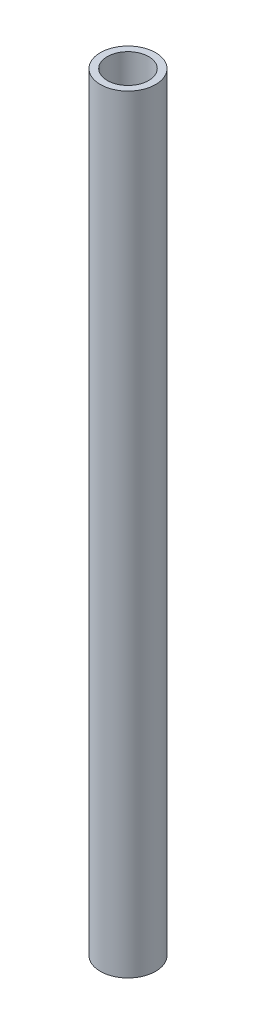
ISO-10303-21;
HEADER;
FILE_DESCRIPTION(('STEP AP214'),'2;1');
FILE_NAME('part.step','',(''),(''),'','','');
FILE_SCHEMA(('AUTOMOTIVE_DESIGN { 1 0 10303 214 1 1 1 1 }'));
ENDSEC;
DATA;
#1=APPLICATION_CONTEXT('core data for automotive mechanical design processes');
#2=APPLICATION_PROTOCOL_DEFINITION('international standard','automotive_design',2000,#1);
#3=PRODUCT_CONTEXT('',#1,'mechanical');
#4=PRODUCT('Part','Part','',(#3));
#5=PRODUCT_RELATED_PRODUCT_CATEGORY('part','',(#4));
#6=PRODUCT_DEFINITION_FORMATION('','',#4);
#7=PRODUCT_DEFINITION_CONTEXT('part definition',#1,'design');
#8=PRODUCT_DEFINITION('design','',#6,#7);
#9=PRODUCT_DEFINITION_SHAPE('','',#8);
#10=(LENGTH_UNIT() NAMED_UNIT(*) SI_UNIT(.MILLI.,.METRE.));
#11=(NAMED_UNIT(*) PLANE_ANGLE_UNIT() SI_UNIT($,.RADIAN.));
#12=(NAMED_UNIT(*) SI_UNIT($,.STERADIAN.) SOLID_ANGLE_UNIT());
#13=UNCERTAINTY_MEASURE_WITH_UNIT(LENGTH_MEASURE(1.E-05),#10,'distance_accuracy_value','');
#14=(GEOMETRIC_REPRESENTATION_CONTEXT(3) GLOBAL_UNCERTAINTY_ASSIGNED_CONTEXT((#13)) GLOBAL_UNIT_ASSIGNED_CONTEXT((#10,
#11,#12)) REPRESENTATION_CONTEXT('',''));
#15=CARTESIAN_POINT('',(0.,0.,0.));
#16=DIRECTION('',(0.,0.,1.));
#17=DIRECTION('',(1.,0.,0.));
#18=AXIS2_PLACEMENT_3D('',#15,#16,#17);
#19=CARTESIAN_POINT('',(0.,13.9,0.));
#20=DIRECTION('',(0.,-1.,0.));
#21=DIRECTION('',(0.,0.,-1.));
#22=AXIS2_PLACEMENT_3D('',#19,#20,#21);
#23=CYLINDRICAL_SURFACE('',#22,0.5);
#24=CARTESIAN_POINT('',(0.,13.9,0.));
#25=DIRECTION('',(0.,1.,0.));
#26=DIRECTION('',(0.,0.,1.));
#27=AXIS2_PLACEMENT_3D('',#24,#25,#26);
#28=CIRCLE('',#27,0.5);
#29=CARTESIAN_POINT('',(0.,13.9,0.5));
#30=VERTEX_POINT('',#29);
#31=EDGE_CURVE('E10',#30,#30,#28,.T.);
#32=ORIENTED_EDGE('',*,*,#31,.F.);
#33=EDGE_LOOP('',(#32));
#34=FACE_BOUND('',#33,.T.);
#35=CARTESIAN_POINT('',(0.,0.,0.));
#36=DIRECTION('',(0.,1.,0.));
#37=DIRECTION('',(0.,0.,1.));
#38=AXIS2_PLACEMENT_3D('',#35,#36,#37);
#39=CIRCLE('',#38,0.5);
#40=CARTESIAN_POINT('',(0.,0.,0.5));
#41=VERTEX_POINT('',#40);
#42=EDGE_CURVE('E40',#41,#41,#39,.T.);
#43=ORIENTED_EDGE('',*,*,#42,.T.);
#44=EDGE_LOOP('',(#43));
#45=FACE_BOUND('',#44,.T.);
#46=ADVANCED_FACE('F33',(#34,#45),#23,.T.);
#47=CARTESIAN_POINT('',(0.,13.9,0.));
#48=DIRECTION('',(0.,1.,0.));
#49=DIRECTION('',(0.,0.,1.));
#50=AXIS2_PLACEMENT_3D('',#47,#48,#49);
#51=PLANE('',#50);
#52=CARTESIAN_POINT('',(0.,13.9,0.));
#53=DIRECTION('',(0.,1.,0.));
#54=DIRECTION('',(0.,0.,1.));
#55=AXIS2_PLACEMENT_3D('',#52,#53,#54);
#56=CIRCLE('',#55,0.375);
#57=CARTESIAN_POINT('',(0.,13.9,0.375));
#58=VERTEX_POINT('',#57);
#59=EDGE_CURVE('E49',#58,#58,#56,.T.);
#60=ORIENTED_EDGE('',*,*,#59,.F.);
#61=EDGE_LOOP('',(#60));
#62=FACE_BOUND('',#61,.T.);
#63=ORIENTED_EDGE('',*,*,#31,.T.);
#64=EDGE_LOOP('',(#63));
#65=FACE_BOUND('',#64,.T.);
#66=ADVANCED_FACE('F65',(#62,#65),#51,.T.);
#67=CARTESIAN_POINT('',(0.,0.,0.));
#68=DIRECTION('',(0.,1.,0.));
#69=DIRECTION('',(0.,0.,1.));
#70=AXIS2_PLACEMENT_3D('',#67,#68,#69);
#71=PLANE('',#70);
#72=CARTESIAN_POINT('',(0.,0.,0.));
#73=DIRECTION('',(0.,-1.,0.));
#74=DIRECTION('',(0.,0.,-1.));
#75=AXIS2_PLACEMENT_3D('',#72,#73,#74);
#76=CIRCLE('',#75,0.299999999999989);
#77=CARTESIAN_POINT('',(0.,0.,-0.299999999999989));
#78=VERTEX_POINT('',#77);
#79=EDGE_CURVE('E55',#78,#78,#76,.T.);
#80=ORIENTED_EDGE('',*,*,#79,.F.);
#81=EDGE_LOOP('',(#80));
#82=FACE_BOUND('',#81,.T.);
#83=ORIENTED_EDGE('',*,*,#42,.F.);
#84=EDGE_LOOP('',(#83));
#85=FACE_BOUND('',#84,.T.);
#86=ADVANCED_FACE('F61',(#82,#85),#71,.F.);
#87=CARTESIAN_POINT('',(0.,2.575,0.));
#88=DIRECTION('',(0.,1.,0.));
#89=DIRECTION('',(0.,0.,1.));
#90=AXIS2_PLACEMENT_3D('',#87,#88,#89);
#91=CONICAL_SURFACE('',#90,0.374999999999997,1.02974425867665);
#92=CARTESIAN_POINT('',(0.,2.47746772678647,0.));
#93=DIRECTION('',(0.,-1.,0.));
#94=DIRECTION('',(0.,0.,-1.));
#95=AXIS2_PLACEMENT_3D('',#92,#93,#94);
#96=CIRCLE('',#95,0.21267903882371);
#97=CARTESIAN_POINT('',(0.,2.47746772678647,-0.21267903882371));
#98=VERTEX_POINT('',#97);
#99=EDGE_CURVE('E36',#98,#98,#96,.T.);
#100=ORIENTED_EDGE('',*,*,#99,.T.);
#101=EDGE_LOOP('',(#100));
#102=FACE_BOUND('',#101,.T.);
#103=CARTESIAN_POINT('',(0.,2.575,0.));
#104=DIRECTION('',(0.,1.,0.));
#105=DIRECTION('',(0.,0.,1.));
#106=AXIS2_PLACEMENT_3D('',#103,#104,#105);
#107=CIRCLE('',#106,0.374999999999997);
#108=CARTESIAN_POINT('',(0.,2.575,0.374999999999997));
#109=VERTEX_POINT('',#108);
#110=EDGE_CURVE('E45',#109,#109,#107,.T.);
#111=ORIENTED_EDGE('',*,*,#110,.T.);
#112=EDGE_LOOP('',(#111));
#113=FACE_BOUND('',#112,.T.);
#114=ADVANCED_FACE('F64',(#102,#113),#91,.F.);
#115=CARTESIAN_POINT('',(0.,13.9,0.));
#116=DIRECTION('',(0.,1.,0.));
#117=DIRECTION('',(0.,0.,1.));
#118=AXIS2_PLACEMENT_3D('',#115,#116,#117);
#119=CYLINDRICAL_SURFACE('',#118,0.374999999999999);
#120=ORIENTED_EDGE('',*,*,#110,.F.);
#121=EDGE_LOOP('',(#120));
#122=FACE_BOUND('',#121,.T.);
#123=ORIENTED_EDGE('',*,*,#59,.T.);
#124=EDGE_LOOP('',(#123));
#125=FACE_BOUND('',#124,.T.);
#126=ADVANCED_FACE('F81',(#122,#125),#119,.F.);
#127=CARTESIAN_POINT('',(0.,2.425,0.));
#128=DIRECTION('',(0.,-1.,0.));
#129=DIRECTION('',(0.,0.,-1.));
#130=AXIS2_PLACEMENT_3D('',#127,#128,#129);
#131=CONICAL_SURFACE('',#130,0.299999999999999,1.02974425867665);
#132=CARTESIAN_POINT('',(0.,2.425,0.));
#133=DIRECTION('',(0.,-1.,0.));
#134=DIRECTION('',(0.,0.,-1.));
#135=AXIS2_PLACEMENT_3D('',#132,#133,#134);
#136=CIRCLE('',#135,0.299999999999999);
#137=CARTESIAN_POINT('',(0.,2.425,-0.299999999999999));
#138=VERTEX_POINT('',#137);
#139=EDGE_CURVE('E52',#138,#138,#136,.T.);
#140=ORIENTED_EDGE('',*,*,#139,.T.);
#141=EDGE_LOOP('',(#140));
#142=FACE_BOUND('',#141,.T.);
#143=ORIENTED_EDGE('',*,*,#99,.F.);
#144=EDGE_LOOP('',(#143));
#145=FACE_BOUND('',#144,.T.);
#146=ADVANCED_FACE('F85',(#142,#145),#131,.F.);
#147=CARTESIAN_POINT('',(0.,0.,0.));
#148=DIRECTION('',(0.,-1.,0.));
#149=DIRECTION('',(0.,0.,-1.));
#150=AXIS2_PLACEMENT_3D('',#147,#148,#149);
#151=CYLINDRICAL_SURFACE('',#150,0.299999999999994);
#152=ORIENTED_EDGE('',*,*,#139,.F.);
#153=EDGE_LOOP('',(#152));
#154=FACE_BOUND('',#153,.T.);
#155=ORIENTED_EDGE('',*,*,#79,.T.);
#156=EDGE_LOOP('',(#155));
#157=FACE_BOUND('',#156,.T.);
#158=ADVANCED_FACE('F59',(#154,#157),#151,.F.);
#159=CLOSED_SHELL('',(#46,#66,#86,#114,#126,#146,#158));
#160=MANIFOLD_SOLID_BREP('B2',#159);
#161=ADVANCED_BREP_SHAPE_REPRESENTATION('',(#18,#160),#14);
#162=SHAPE_DEFINITION_REPRESENTATION(#9,#161);
ENDSEC;
END-ISO-10303-21;
